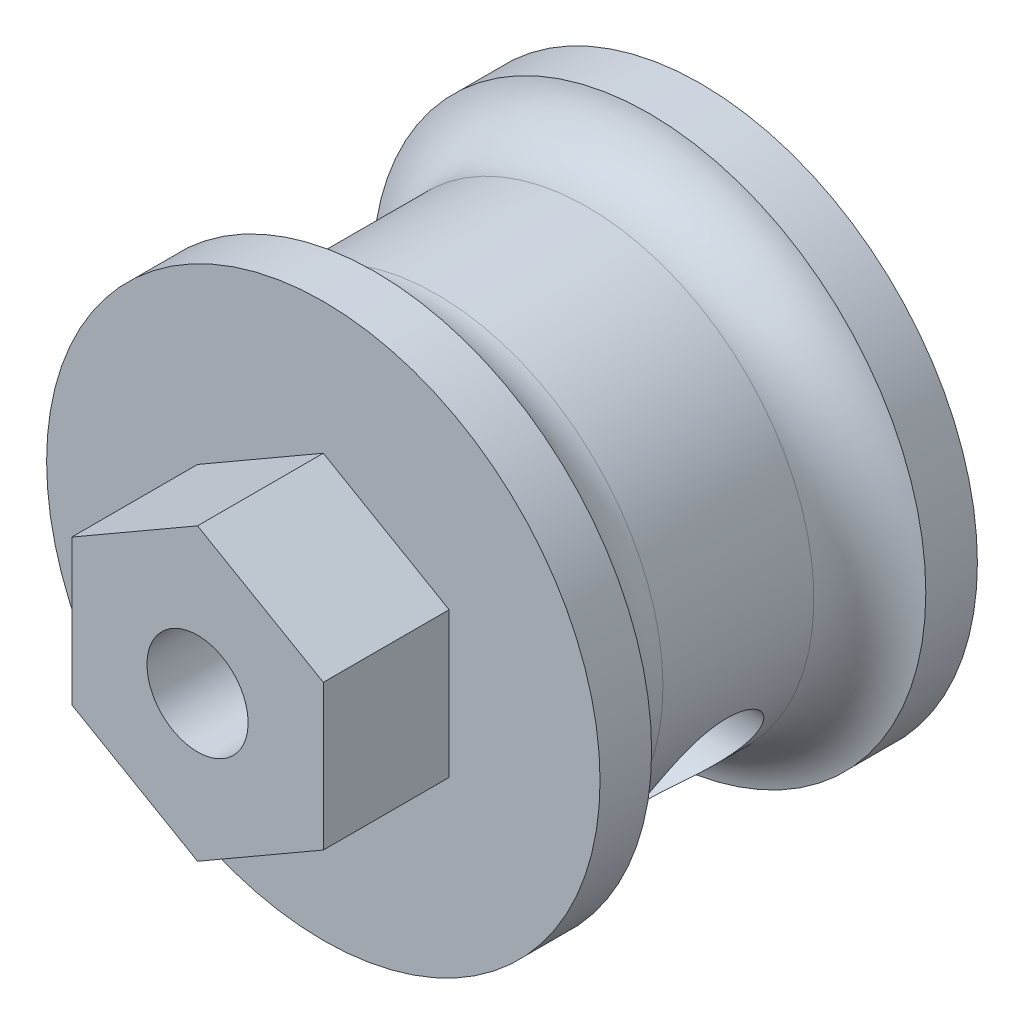
ISO-10303-21;
HEADER;
FILE_DESCRIPTION(('STEP AP214'),'2;1');
FILE_NAME('part.step','',(''),(''),'','','');
FILE_SCHEMA(('AUTOMOTIVE_DESIGN { 1 0 10303 214 1 1 1 1 }'));
ENDSEC;
DATA;
#1=APPLICATION_CONTEXT('core data for automotive mechanical design processes');
#2=APPLICATION_PROTOCOL_DEFINITION('international standard','automotive_design',2000,#1);
#3=PRODUCT_CONTEXT('',#1,'mechanical');
#4=PRODUCT('Part','Part','',(#3));
#5=PRODUCT_RELATED_PRODUCT_CATEGORY('part','',(#4));
#6=PRODUCT_DEFINITION_FORMATION('','',#4);
#7=PRODUCT_DEFINITION_CONTEXT('part definition',#1,'design');
#8=PRODUCT_DEFINITION('design','',#6,#7);
#9=PRODUCT_DEFINITION_SHAPE('','',#8);
#10=(LENGTH_UNIT() NAMED_UNIT(*) SI_UNIT(.MILLI.,.METRE.));
#11=(NAMED_UNIT(*) PLANE_ANGLE_UNIT() SI_UNIT($,.RADIAN.));
#12=(NAMED_UNIT(*) SI_UNIT($,.STERADIAN.) SOLID_ANGLE_UNIT());
#13=UNCERTAINTY_MEASURE_WITH_UNIT(LENGTH_MEASURE(1.E-05),#10,'distance_accuracy_value','');
#14=(GEOMETRIC_REPRESENTATION_CONTEXT(3) GLOBAL_UNCERTAINTY_ASSIGNED_CONTEXT((#13)) GLOBAL_UNIT_ASSIGNED_CONTEXT((#10,
#11,#12)) REPRESENTATION_CONTEXT('',''));
#15=CARTESIAN_POINT('',(0.,0.,0.));
#16=DIRECTION('',(0.,0.,1.));
#17=DIRECTION('',(1.,0.,0.));
#18=AXIS2_PLACEMENT_3D('',#15,#16,#17);
#19=CARTESIAN_POINT('',(0.,-46.36135,19.05));
#20=DIRECTION('',(0.,0.,-1.));
#21=DIRECTION('',(-1.,0.,0.));
#22=AXIS2_PLACEMENT_3D('',#19,#20,#21);
#23=PLANE('',#22);
#24=CARTESIAN_POINT('',(0.,-38.1,19.05));
#25=DIRECTION('',(0.,0.,-1.));
#26=DIRECTION('',(-1.,0.,0.));
#27=AXIS2_PLACEMENT_3D('',#24,#25,#26);
#28=CIRCLE('',#27,13.97);
#29=CARTESIAN_POINT('',(-13.97,-38.1,19.05));
#30=VERTEX_POINT('',#29);
#31=EDGE_CURVE('E134',#30,#30,#28,.T.);
#32=ORIENTED_EDGE('',*,*,#31,.F.);
#33=EDGE_LOOP('',(#32));
#34=FACE_BOUND('',#33,.T.);
#35=DIRECTION('',(-0.866025403784439,-0.5,0.));
#36=VECTOR('',#35,1.);
#37=CARTESIAN_POINT('',(-3.175,-32.6007386859688,19.05));
#38=LINE('',#37,#36);
#39=CARTESIAN_POINT('',(0.,-30.7676515812918,19.05));
#40=VERTEX_POINT('',#39);
#41=CARTESIAN_POINT('',(-6.35,-34.4338257906459,19.05));
#42=VERTEX_POINT('',#41);
#43=EDGE_CURVE('E32',#40,#42,#38,.T.);
#44=ORIENTED_EDGE('',*,*,#43,.F.);
#45=DIRECTION('',(-0.866025403784438,0.5,0.));
#46=VECTOR('',#45,1.);
#47=CARTESIAN_POINT('',(3.175,-32.6007386859688,19.05));
#48=LINE('',#47,#46);
#49=CARTESIAN_POINT('',(6.35,-34.4338257906459,19.05));
#50=VERTEX_POINT('',#49);
#51=EDGE_CURVE('E36',#50,#40,#48,.T.);
#52=ORIENTED_EDGE('',*,*,#51,.F.);
#53=DIRECTION('',(0.,1.,0.));
#54=VECTOR('',#53,1.);
#55=CARTESIAN_POINT('',(6.35,-38.1,19.05));
#56=LINE('',#55,#54);
#57=CARTESIAN_POINT('',(6.35,-41.7661742093541,19.05));
#58=VERTEX_POINT('',#57);
#59=EDGE_CURVE('E271',#58,#50,#56,.T.);
#60=ORIENTED_EDGE('',*,*,#59,.F.);
#61=DIRECTION('',(0.866025403784439,0.5,0.));
#62=VECTOR('',#61,1.);
#63=CARTESIAN_POINT('',(3.175,-43.5992613140312,19.05));
#64=LINE('',#63,#62);
#65=CARTESIAN_POINT('',(0.,-45.4323484187082,19.05));
#66=VERTEX_POINT('',#65);
#67=EDGE_CURVE('E287',#66,#58,#64,.T.);
#68=ORIENTED_EDGE('',*,*,#67,.F.);
#69=DIRECTION('',(0.866025403784438,-0.5,0.));
#70=VECTOR('',#69,1.);
#71=CARTESIAN_POINT('',(-3.175,-43.5992613140312,19.05));
#72=LINE('',#71,#70);
#73=CARTESIAN_POINT('',(-6.35,-41.7661742093541,19.05));
#74=VERTEX_POINT('',#73);
#75=EDGE_CURVE('E284',#74,#66,#72,.T.);
#76=ORIENTED_EDGE('',*,*,#75,.F.);
#77=DIRECTION('',(0.,-1.,0.));
#78=VECTOR('',#77,1.);
#79=CARTESIAN_POINT('',(-6.35,-38.1,19.05));
#80=LINE('',#79,#78);
#81=EDGE_CURVE('E282',#42,#74,#80,.T.);
#82=ORIENTED_EDGE('',*,*,#81,.F.);
#83=EDGE_LOOP('',(#44,#52,#60,#68,#76,#82));
#84=FACE_BOUND('',#83,.T.);
#85=ADVANCED_FACE('F17',(#34,#84),#23,.F.);
#86=CARTESIAN_POINT('',(0.,-38.1,9.525));
#87=DIRECTION('',(0.,0.,-1.));
#88=DIRECTION('',(-1.,0.,0.));
#89=AXIS2_PLACEMENT_3D('',#86,#87,#88);
#90=CYLINDRICAL_SURFACE('',#89,11.43);
#91=CARTESIAN_POINT('',(-9.48678949065488,-44.4754,5.715));
#92=CARTESIAN_POINT('',(-9.55528350161054,-44.3735081379144,5.71499298819661));
#93=CARTESIAN_POINT('',(-9.62213094625265,-44.2704622217479,5.71908817780301));
#94=CARTESIAN_POINT('',(-9.75222618173327,-44.062710723665,5.73598345976555));
#95=CARTESIAN_POINT('',(-9.81547093880646,-43.9580038352138,5.74879077437321));
#96=CARTESIAN_POINT('',(-9.93823601961678,-43.7472411411777,5.78369680806214));
#97=CARTESIAN_POINT('',(-9.99773681655364,-43.6411812581887,5.80584023767689));
#98=CARTESIAN_POINT('',(-10.1123337464472,-43.4291757716585,5.85982944465942));
#99=CARTESIAN_POINT('',(-10.1674310324981,-43.3232301454141,5.89167267148086));
#100=CARTESIAN_POINT('',(-10.2732586056937,-43.1118960168256,5.96556808677806));
#101=CARTESIAN_POINT('',(-10.3239627312728,-43.0065139493173,6.0076764043738));
#102=CARTESIAN_POINT('',(-10.4204486867376,-42.7981200844263,6.10214782593002));
#103=CARTESIAN_POINT('',(-10.4662309912993,-42.6951080592236,6.15450993960476));
#104=CARTESIAN_POINT('',(-10.5526580342309,-42.4929898597353,6.26929408198158));
#105=CARTESIAN_POINT('',(-10.5933159160526,-42.393874161094,6.33168939997622));
#106=CARTESIAN_POINT('',(-10.6696290458326,-42.2005746921232,6.4663825224243));
#107=CARTESIAN_POINT('',(-10.7052850109717,-42.1063902159655,6.5386789043077));
#108=CARTESIAN_POINT('',(-10.7679394727047,-41.9345503512047,6.68398365362768));
#109=CARTESIAN_POINT('',(-10.7954611251133,-41.8562310562385,6.7559839907424));
#110=CARTESIAN_POINT('',(-10.8468049835884,-41.7052849345481,6.90699291037972));
#111=CARTESIAN_POINT('',(-10.870625989883,-41.6326599577205,6.98600375276125));
#112=CARTESIAN_POINT('',(-10.9147421944506,-41.4939072401391,7.15047284033617));
#113=CARTESIAN_POINT('',(-10.9350368835693,-41.4277804382349,7.23593201403398));
#114=CARTESIAN_POINT('',(-10.9723195641483,-41.302712152489,7.41268459716464));
#115=CARTESIAN_POINT('',(-10.9893063458653,-41.2437733003048,7.50398012487309));
#116=CARTESIAN_POINT('',(-11.0193834917986,-41.1366134559686,7.68673207610903));
#117=CARTESIAN_POINT('',(-11.0326316544562,-41.0879921056153,7.77792815927739));
#118=CARTESIAN_POINT('',(-11.0565601653245,-40.9981955188877,7.9642784770862));
#119=CARTESIAN_POINT('',(-11.0672396062507,-40.957022914714,8.05943409637416));
#120=CARTESIAN_POINT('',(-11.0862030376975,-40.8825319491873,8.25294054110255));
#121=CARTESIAN_POINT('',(-11.0944885187034,-40.8492087032029,8.35128933584633));
#122=CARTESIAN_POINT('',(-11.1088322647352,-40.7906576717666,8.55053712712864));
#123=CARTESIAN_POINT('',(-11.1148897032622,-40.7654328909046,8.65143705521408));
#124=CARTESIAN_POINT('',(-11.1298983453744,-40.7023554621676,8.95649905825234));
#125=CARTESIAN_POINT('',(-11.1357342176093,-40.676901456606,9.1635389396154));
#126=CARTESIAN_POINT('',(-11.1396056199392,-40.6601049836764,9.57897505746806));
#127=CARTESIAN_POINT('',(-11.1376404842515,-40.6687654278305,9.78737140821114));
#128=CARTESIAN_POINT('',(-11.1257034494241,-40.7199836391951,10.2005977338773));
#129=CARTESIAN_POINT('',(-11.11569981163,-40.7626757693677,10.4054102770268));
#130=CARTESIAN_POINT('',(-11.0867572151229,-40.8807149047953,10.8047214190575));
#131=CARTESIAN_POINT('',(-11.0678187683124,-40.9560600392402,10.9992206081121));
#132=CARTESIAN_POINT('',(-11.0196549040371,-41.1365715484436,11.3719126779701));
#133=CARTESIAN_POINT('',(-10.9904533871585,-41.2416685275767,11.5501422428716));
#134=CARTESIAN_POINT('',(-10.920156601719,-41.4778997039078,11.8857613867387));
#135=CARTESIAN_POINT('',(-10.8790623016428,-41.6090317806739,12.0431526611427));
#136=CARTESIAN_POINT('',(-10.7837400451109,-41.8918308493033,12.3325006423125));
#137=CARTESIAN_POINT('',(-10.7295566409318,-42.0434274284976,12.4645409582674));
#138=CARTESIAN_POINT('',(-10.607189098811,-42.3616247542437,12.7010601391913));
#139=CARTESIAN_POINT('',(-10.539006694769,-42.5282236411938,12.8055424138092));
#140=CARTESIAN_POINT('',(-10.3868911002746,-42.8742988162341,12.987909817481));
#141=CARTESIAN_POINT('',(-10.3026270643302,-43.0539850551563,13.0651163378358));
#142=CARTESIAN_POINT('',(-10.1202407577416,-43.4166561084806,13.1899660473463));
#143=CARTESIAN_POINT('',(-10.0221092087801,-43.5996430591907,13.2375893272302));
#144=CARTESIAN_POINT('',(-9.85067390652596,-43.898921046763,13.2930309006267));
#145=CARTESIAN_POINT('',(-9.78091297177308,-44.0158427813386,13.3089768552178));
#146=CARTESIAN_POINT('',(-9.63703913460951,-44.2474376839007,13.3299438259072));
#147=CARTESIAN_POINT('',(-9.56294169909329,-44.3621171042608,13.3350014970089));
#148=CARTESIAN_POINT('',(-9.48678949065489,-44.4754,13.335));
#149=B_SPLINE_CURVE_WITH_KNOTS('',3,(#91,#92,#93,#94,#95,#96,#97,#98,#99,#100,#101,#102,#103,
#104,#105,#106,#107,#108,#109,#110,#111,#112,#113,#114,#115,#116,#117,#118,#119,#120,#121,#122,
#123,#124,#125,#126,#127,#128,#129,#130,#131,#132,#133,#134,#135,#136,#137,#138,#139,#140,#141,
#142,#143,#144,#145,#146,#147,#148),.UNSPECIFIED.,.F.,.F.,(4,2,2,2,2,2,2,2,2,2,2,2,2,2,2,2,2,2,
2,2,2,2,2,2,2,2,2,2,4),(0.,0.368295002018657,0.736895689033342,1.10728201791471,
1.47757103824544,1.84993208123406,2.22225718025307,2.59360699303281,2.9649035066941,
3.29414729628739,3.62349760696048,3.95289543208676,4.28241349682817,4.5946230744199,
4.90694276448426,5.21906758245317,5.53130806755451,6.15414642557903,6.77703794133937,
7.40240099383736,8.02772822173075,8.65160873606145,9.27543845918768,9.89717401003109,
10.5188325998403,11.1550187523914,11.7916325903299,12.2023954081563,12.6117732316374),.UNSPECIFIED.);
#150=CARTESIAN_POINT('',(-9.48678949065488,-44.4754,5.715));
#151=VERTEX_POINT('',#150);
#152=CARTESIAN_POINT('',(-9.48678949065488,-44.4754,13.335));
#153=VERTEX_POINT('',#152);
#154=EDGE_CURVE('E204',#151,#153,#149,.T.);
#155=ORIENTED_EDGE('',*,*,#154,.T.);
#156=CARTESIAN_POINT('',(0.,-38.1,13.335));
#157=DIRECTION('',(0.,0.,1.));
#158=DIRECTION('',(1.,0.,0.));
#159=AXIS2_PLACEMENT_3D('',#156,#157,#158);
#160=CIRCLE('',#159,11.43);
#161=CARTESIAN_POINT('',(-5.08,-48.3390673403392,13.335));
#162=VERTEX_POINT('',#161);
#163=EDGE_CURVE('E203',#153,#162,#160,.F.);
#164=ORIENTED_EDGE('',*,*,#163,.T.);
#165=DIRECTION('',(0.,0.,-1.));
#166=VECTOR('',#165,1.);
#167=CARTESIAN_POINT('',(-5.08,-48.3390673403392,9.525));
#168=LINE('',#167,#166);
#169=CARTESIAN_POINT('',(-5.08,-48.3390673403392,5.715));
#170=VERTEX_POINT('',#169);
#171=EDGE_CURVE('E130',#162,#170,#168,.T.);
#172=ORIENTED_EDGE('',*,*,#171,.T.);
#173=CARTESIAN_POINT('',(0.,-38.1,5.715));
#174=DIRECTION('',(0.,0.,-1.));
#175=DIRECTION('',(-1.,0.,0.));
#176=AXIS2_PLACEMENT_3D('',#173,#174,#175);
#177=CIRCLE('',#176,11.43);
#178=EDGE_CURVE('E199',#170,#151,#177,.F.);
#179=ORIENTED_EDGE('',*,*,#178,.T.);
#180=EDGE_LOOP('',(#155,#164,#172,#179));
#181=FACE_BOUND('',#180,.T.);
#182=CARTESIAN_POINT('',(9.48678949065488,-44.4754,6.731));
#183=CARTESIAN_POINT('',(9.42068728047673,-44.5737611387116,6.73099997835017));
#184=CARTESIAN_POINT('',(9.35303741450383,-44.6711128783271,6.73619538392011));
#185=CARTESIAN_POINT('',(9.21521346613033,-44.8630409854268,6.75633736179169));
#186=CARTESIAN_POINT('',(9.14503758391582,-44.957615283205,6.77129102230727));
#187=CARTESIAN_POINT('',(9.00252438545298,-45.1436650400816,6.81042413590952));
#188=CARTESIAN_POINT('',(8.93018076751102,-45.2351293892079,6.834633512694));
#189=CARTESIAN_POINT('',(8.78418423052112,-45.4141222419487,6.89173933505054));
#190=CARTESIAN_POINT('',(8.71053157977484,-45.5016515394086,6.92463401918842));
#191=CARTESIAN_POINT('',(8.48972068304826,-45.7563361045266,7.0350811693391));
#192=CARTESIAN_POINT('',(8.34130640311109,-45.9174053213202,7.1247940523502));
#193=CARTESIAN_POINT('',(8.12065594718471,-46.1443197345132,7.28232038593415));
#194=CARTESIAN_POINT('',(8.04744138899779,-46.2175031650131,7.33864866735168));
#195=CARTESIAN_POINT('',(7.90244064004287,-46.3587254385751,7.45905648794177));
#196=CARTESIAN_POINT('',(7.83065403554464,-46.426765788257,7.52313374270946));
#197=CARTESIAN_POINT('',(7.65642146449339,-46.5878734608606,7.69112200952139));
#198=CARTESIAN_POINT('',(7.55536861432803,-46.6777311425436,7.79963044187247));
#199=CARTESIAN_POINT('',(7.36323006381145,-46.8432103370553,8.0348523430969));
#200=CARTESIAN_POINT('',(7.27212807589897,-46.9188552640559,8.16153525298436));
#201=CARTESIAN_POINT('',(7.13251056837468,-47.0318344561213,8.3926658192894));
#202=CARTESIAN_POINT('',(7.07948680923593,-47.0738130583412,8.49208571873815));
#203=CARTESIAN_POINT('',(6.98553301746977,-47.1471418907582,8.70017076489355));
#204=CARTESIAN_POINT('',(6.94458253710025,-47.1785101045241,8.80881987385447));
#205=CARTESIAN_POINT('',(6.88494676114968,-47.2237910374511,9.0134518447762));
#206=CARTESIAN_POINT('',(6.86357215846582,-47.2398362745573,9.10816466061194));
#207=CARTESIAN_POINT('',(6.83387164167014,-47.2620661761461,9.30073813300019));
#208=CARTESIAN_POINT('',(6.82553343381557,-47.2682601308025,9.39859573491161));
#209=CARTESIAN_POINT('',(6.82285572921696,-47.270253256694,9.59480810540598));
#210=CARTESIAN_POINT('',(6.8285435639455,-47.2660321328559,9.69316347137918));
#211=CARTESIAN_POINT('',(6.85329254337115,-47.2475409949907,9.8872129705383));
#212=CARTESIAN_POINT('',(6.87236512459736,-47.2332623873588,9.98290475509221));
#213=CARTESIAN_POINT('',(6.92802493699494,-47.1911411304439,10.1922405923491));
#214=CARTESIAN_POINT('',(6.96775871126224,-47.1608321348129,10.3045380397089));
#215=CARTESIAN_POINT('',(7.06038960468063,-47.088839740722,10.5196381348261));
#216=CARTESIAN_POINT('',(7.11331416049084,-47.0471326166266,10.622420372151));
#217=CARTESIAN_POINT('',(7.25661086034067,-46.9316780446926,10.8663738975714));
#218=CARTESIAN_POINT('',(7.35258998508993,-46.8522663066101,11.0015265649022));
#219=CARTESIAN_POINT('',(7.5558139132904,-46.6774507611769,11.2514818161764));
#220=CARTESIAN_POINT('',(7.66308338188551,-46.5820116575957,11.3662383087135));
#221=CARTESIAN_POINT('',(7.84873064589295,-46.4098135801775,11.5435550891194));
#222=CARTESIAN_POINT('',(7.9256182074992,-46.33658381434,11.6111977395122));
#223=CARTESIAN_POINT('',(8.08090939185512,-46.1842824067236,11.7376824849069));
#224=CARTESIAN_POINT('',(8.15931351589115,-46.1052088080864,11.7965216118417));
#225=CARTESIAN_POINT('',(8.31663200440622,-45.9416463757245,11.905379751891));
#226=CARTESIAN_POINT('',(8.39554649556655,-45.8571561471791,11.9553964806357));
#227=CARTESIAN_POINT('',(8.55308337440856,-45.6831028315147,12.0464159349984));
#228=CARTESIAN_POINT('',(8.63170560011267,-45.5935372803386,12.0874142342115));
#229=CARTESIAN_POINT('',(8.7884215851226,-45.4091236131963,12.1602401716093));
#230=CARTESIAN_POINT('',(8.86650787600748,-45.3142431148018,12.19200210582));
#231=CARTESIAN_POINT('',(9.02087217488916,-45.1202654792798,12.245423328392));
#232=CARTESIAN_POINT('',(9.09715040160854,-45.0211688562749,12.2670838447091));
#233=CARTESIAN_POINT('',(9.24709263559753,-44.8195183504524,12.2996040022807));
#234=CARTESIAN_POINT('',(9.32076070355206,-44.7169703697275,12.310481201259));
#235=CARTESIAN_POINT('',(9.46487704559083,-44.5091347405894,12.3207329225754));
#236=CARTESIAN_POINT('',(9.53532651376782,-44.4038481313288,12.3201117460985));
#237=CARTESIAN_POINT('',(9.70471712623466,-44.1413453676988,12.3033736378088));
#238=CARTESIAN_POINT('',(9.80142348036796,-43.9830594679815,12.2800858672301));
#239=CARTESIAN_POINT('',(9.98423231969735,-43.667155579896,12.2044539353537));
#240=CARTESIAN_POINT('',(10.0703402479469,-43.5095372891645,12.152124765618));
#241=CARTESIAN_POINT('',(10.1903606424656,-43.2777588304976,12.0507289286072));
#242=CARTESIAN_POINT('',(10.2289790334192,-43.2009780723255,12.0129165499454));
#243=CARTESIAN_POINT('',(10.3028688672286,-43.0500329121976,11.9296168718205));
#244=CARTESIAN_POINT('',(10.3381419083033,-42.9758672716343,11.8841332663863));
#245=CARTESIAN_POINT('',(10.4052006685171,-42.8310749442386,11.7855964047065));
#246=CARTESIAN_POINT('',(10.4369868327246,-42.7604478063749,11.7325441165281));
#247=CARTESIAN_POINT('',(10.4969821144457,-42.623698540341,11.6191678350094));
#248=CARTESIAN_POINT('',(10.5251917205267,-42.5575757974305,11.5588448370681));
#249=CARTESIAN_POINT('',(10.5981570741826,-42.3823582201649,11.3825989637257));
#250=CARTESIAN_POINT('',(10.6391454789831,-42.2789031681307,11.2593293494719));
#251=CARTESIAN_POINT('',(10.7100417069427,-42.0937222675332,10.9947401942827));
#252=CARTESIAN_POINT('',(10.7399543339013,-42.0119870029911,10.8534285144219));
#253=CARTESIAN_POINT('',(10.7874571861122,-41.8789284072252,10.5679530847001));
#254=CARTESIAN_POINT('',(10.8057827298049,-41.8258317552287,10.4247364630884));
#255=CARTESIAN_POINT('',(10.8337899544648,-41.7435979429715,10.1307859304557));
#256=CARTESIAN_POINT('',(10.8434731538405,-41.7144565739808,9.98005334486081));
#257=CARTESIAN_POINT('',(10.8543587405995,-41.6816320343877,9.67899254682022));
#258=CARTESIAN_POINT('',(10.8557470762306,-41.6773907108003,9.52873156980151));
#259=CARTESIAN_POINT('',(10.8505821178069,-41.6930258011586,9.22961087966055));
#260=CARTESIAN_POINT('',(10.8440292117461,-41.7129010368149,9.08075109843662));
#261=CARTESIAN_POINT('',(10.8228299079689,-41.7759134077951,8.78922428552127));
#262=CARTESIAN_POINT('',(10.8082135809293,-41.818964101231,8.6465363566341));
#263=CARTESIAN_POINT('',(10.7705527781845,-41.926659959187,8.37075917934343));
#264=CARTESIAN_POINT('',(10.7475085390361,-41.9913045176008,8.23766966165492));
#265=CARTESIAN_POINT('',(10.6924221919768,-42.1402130006748,7.98385703915091));
#266=CARTESIAN_POINT('',(10.6603241355032,-42.2245983430144,7.86321740997221));
#267=CARTESIAN_POINT('',(10.5869187414888,-42.4095151365627,7.63826719834107));
#268=CARTESIAN_POINT('',(10.5456116220607,-42.510046205351,7.53395622925088));
#269=CARTESIAN_POINT('',(10.4525456164099,-42.7263801143558,7.34121600183861));
#270=CARTESIAN_POINT('',(10.4005363090334,-42.8425200112907,7.25328724735429));
#271=CARTESIAN_POINT('',(10.2871560171401,-43.0836810057648,7.09803793774488));
#272=CARTESIAN_POINT('',(10.2257800149042,-43.2087068441893,7.03072848680649));
#273=CARTESIAN_POINT('',(10.0897729925309,-43.4726102448365,6.91287444993781));
#274=CARTESIAN_POINT('',(10.0145100256203,-43.6118408200645,6.8638608513438));
#275=CARTESIAN_POINT('',(9.85546258221713,-43.8914236908755,6.78888197351615));
#276=CARTESIAN_POINT('',(9.77168552221405,-44.0317749137157,6.76289682317037));
#277=CARTESIAN_POINT('',(9.6523983822745,-44.2220730756956,6.74203138335628));
#278=CARTESIAN_POINT('',(9.61987664908113,-44.273049810963,6.7378728424776));
#279=CARTESIAN_POINT('',(9.55396768928843,-44.3745721825639,6.73235770889757));
#280=CARTESIAN_POINT('',(9.52058080931735,-44.4251179810894,6.73100001106735));
#281=CARTESIAN_POINT('',(9.48678949065488,-44.4754,6.731));
#282=B_SPLINE_CURVE_WITH_KNOTS('',3,(#182,#183,#184,#185,#186,#187,#188,#189,#190,#191,#192,
#193,#194,#195,#196,#197,#198,#199,#200,#201,#202,#203,#204,#205,#206,#207,#208,#209,#210,#211,
#212,#213,#214,#215,#216,#217,#218,#219,#220,#221,#222,#223,#224,#225,#226,#227,#228,#229,#230,
#231,#232,#233,#234,#235,#236,#237,#238,#239,#240,#241,#242,#243,#244,#245,#246,#247,#248,#249,
#250,#251,#252,#253,#254,#255,#256,#257,#258,#259,#260,#261,#262,#263,#264,#265,#266,#267,#268,
#269,#270,#271,#272,#273,#274,#275,#276,#277,#278,#279,#280,#281),.UNSPECIFIED.,.T.,.F.,(4,2,2,
2,2,2,2,2,2,2,2,2,2,2,2,2,2,2,2,2,2,2,2,2,2,2,2,2,2,2,2,2,2,2,2,2,2,2,2,2,2,2,2,2,2,2,2,2,2,4),
(0.,0.355458299712571,0.711175085524168,1.06805176273938,1.42485611867143,2.13154737728958,
2.48482356288731,2.8379958550478,3.35663345849568,3.87440901673198,4.2340296802024,
4.59303773140336,4.88702248592823,5.18072983572113,5.47500996256914,5.76954184221741,
6.13624432847796,6.50371601135665,7.05213682350521,7.60178162488474,7.97903990723943,
8.35642509525321,8.73390785604313,9.11157548068871,9.49186741297466,9.87211310388501,
10.2517386453613,10.6312221835859,11.1897005549855,11.7478909001118,12.0292340168347,
12.3104420394275,12.5916141264897,12.8727477632231,13.368060192397,13.863157541737,
14.3224116168672,14.7815849878888,15.2304251260773,15.6792433356732,16.1263989859001,
16.5735420862172,17.0235112580082,17.4734697736038,17.9354862067529,18.3977510156094,
18.8928607691903,19.3875428783281,19.569324194928,19.75103377233),.UNSPECIFIED.);
#283=CARTESIAN_POINT('',(9.48678949065488,-44.4754,6.731));
#284=VERTEX_POINT('',#283);
#285=EDGE_CURVE('E133',#284,#284,#282,.T.);
#286=ORIENTED_EDGE('',*,*,#285,.T.);
#287=EDGE_LOOP('',(#286));
#288=FACE_BOUND('',#287,.T.);
#289=ADVANCED_FACE('F152',(#181,#288),#90,.T.);
#290=CARTESIAN_POINT('',(0.,-38.1,9.525));
#291=DIRECTION('',(0.,0.,-1.));
#292=DIRECTION('',(-1.,0.,0.));
#293=AXIS2_PLACEMENT_3D('',#290,#291,#292);
#294=CYLINDRICAL_SURFACE('',#293,13.97);
#295=CARTESIAN_POINT('',(0.,-38.1,2.60414802666537));
#296=DIRECTION('',(0.,0.,-1.));
#297=DIRECTION('',(-1.,0.,0.));
#298=AXIS2_PLACEMENT_3D('',#295,#296,#297);
#299=CIRCLE('',#298,13.97);
#300=CARTESIAN_POINT('',(-13.97,-38.1,2.60414802666537));
#301=VERTEX_POINT('',#300);
#302=EDGE_CURVE('E11',#301,#301,#299,.T.);
#303=ORIENTED_EDGE('',*,*,#302,.T.);
#304=EDGE_LOOP('',(#303));
#305=FACE_BOUND('',#304,.T.);
#306=CARTESIAN_POINT('',(0.,-38.1,0.));
#307=DIRECTION('',(0.,0.,-1.));
#308=DIRECTION('',(-1.,0.,0.));
#309=AXIS2_PLACEMENT_3D('',#306,#307,#308);
#310=CIRCLE('',#309,13.97);
#311=CARTESIAN_POINT('',(-13.97,-38.1,0.));
#312=VERTEX_POINT('',#311);
#313=EDGE_CURVE('E140',#312,#312,#310,.T.);
#314=ORIENTED_EDGE('',*,*,#313,.F.);
#315=EDGE_LOOP('',(#314));
#316=FACE_BOUND('',#315,.T.);
#317=ADVANCED_FACE('F177',(#305,#316),#294,.T.);
#318=CARTESIAN_POINT('',(0.,-46.36135,0.));
#319=DIRECTION('',(0.,0.,1.));
#320=DIRECTION('',(1.,0.,0.));
#321=AXIS2_PLACEMENT_3D('',#318,#319,#320);
#322=PLANE('',#321);
#323=CARTESIAN_POINT('',(0.,-38.1,0.));
#324=DIRECTION('',(0.,0.,-1.));
#325=DIRECTION('',(-1.,0.,0.));
#326=AXIS2_PLACEMENT_3D('',#323,#324,#325);
#327=CIRCLE('',#326,2.5527);
#328=CARTESIAN_POINT('',(-2.5527,-38.1,0.));
#329=VERTEX_POINT('',#328);
#330=EDGE_CURVE('E137',#329,#329,#327,.T.);
#331=ORIENTED_EDGE('',*,*,#330,.F.);
#332=EDGE_LOOP('',(#331));
#333=FACE_BOUND('',#332,.T.);
#334=ORIENTED_EDGE('',*,*,#313,.T.);
#335=EDGE_LOOP('',(#334));
#336=FACE_BOUND('',#335,.T.);
#337=ADVANCED_FACE('F174',(#333,#336),#322,.F.);
#338=CARTESIAN_POINT('',(0.,-38.1,9.525));
#339=DIRECTION('',(0.,0.,-1.));
#340=DIRECTION('',(-1.,0.,0.));
#341=AXIS2_PLACEMENT_3D('',#338,#339,#340);
#342=CYLINDRICAL_SURFACE('',#341,2.5527);
#343=ORIENTED_EDGE('',*,*,#330,.T.);
#344=EDGE_LOOP('',(#343));
#345=FACE_BOUND('',#344,.T.);
#346=CARTESIAN_POINT('',(0.,-38.1,25.4));
#347=DIRECTION('',(0.,0.,-1.));
#348=DIRECTION('',(-1.,0.,0.));
#349=AXIS2_PLACEMENT_3D('',#346,#347,#348);
#350=CIRCLE('',#349,2.5527);
#351=CARTESIAN_POINT('',(-2.5527,-38.1,25.4));
#352=VERTEX_POINT('',#351);
#353=EDGE_CURVE('E106',#352,#352,#350,.T.);
#354=ORIENTED_EDGE('',*,*,#353,.F.);
#355=EDGE_LOOP('',(#354));
#356=FACE_BOUND('',#355,.T.);
#357=ADVANCED_FACE('F167',(#345,#356),#342,.F.);
#358=CARTESIAN_POINT('',(0.,-38.1,9.525));
#359=DIRECTION('',(0.,0.,-1.));
#360=DIRECTION('',(-1.,0.,0.));
#361=AXIS2_PLACEMENT_3D('',#358,#359,#360);
#362=CYLINDRICAL_SURFACE('',#361,13.97);
#363=CARTESIAN_POINT('',(0.,-38.1,16.4458519733347));
#364=DIRECTION('',(0.,0.,1.));
#365=DIRECTION('',(1.,0.,0.));
#366=AXIS2_PLACEMENT_3D('',#363,#364,#365);
#367=CIRCLE('',#366,13.97);
#368=CARTESIAN_POINT('',(13.97,-38.1,16.4458519733347));
#369=VERTEX_POINT('',#368);
#370=EDGE_CURVE('E25',#369,#369,#367,.T.);
#371=ORIENTED_EDGE('',*,*,#370,.T.);
#372=EDGE_LOOP('',(#371));
#373=FACE_BOUND('',#372,.T.);
#374=ORIENTED_EDGE('',*,*,#31,.T.);
#375=EDGE_LOOP('',(#374));
#376=FACE_BOUND('',#375,.T.);
#377=ADVANCED_FACE('F161',(#373,#376),#362,.T.);
#378=CARTESIAN_POINT('',(-12.7,-44.4754,9.525));
#379=DIRECTION('',(1.,0.,0.));
#380=DIRECTION('',(0.,0.,-1.));
#381=AXIS2_PLACEMENT_3D('',#378,#379,#380);
#382=CYLINDRICAL_SURFACE('',#381,2.794);
#383=CARTESIAN_POINT('',(-5.08,-44.4754,9.525));
#384=DIRECTION('',(1.,0.,0.));
#385=DIRECTION('',(0.,0.,-1.));
#386=AXIS2_PLACEMENT_3D('',#383,#384,#385);
#387=CIRCLE('',#386,2.794);
#388=CARTESIAN_POINT('',(-5.08,-44.4754,6.731));
#389=VERTEX_POINT('',#388);
#390=EDGE_CURVE('E109',#389,#389,#387,.T.);
#391=ORIENTED_EDGE('',*,*,#390,.F.);
#392=EDGE_LOOP('',(#391));
#393=FACE_BOUND('',#392,.T.);
#394=ORIENTED_EDGE('',*,*,#285,.F.);
#395=EDGE_LOOP('',(#394));
#396=FACE_BOUND('',#395,.T.);
#397=ADVANCED_FACE('F155',(#393,#396),#382,.F.);
#398=CARTESIAN_POINT('',(-30.48,-44.4754,9.525));
#399=DIRECTION('',(1.,0.,0.));
#400=DIRECTION('',(0.,0.,-1.));
#401=AXIS2_PLACEMENT_3D('',#398,#399,#400);
#402=CYLINDRICAL_SURFACE('',#401,3.81);
#403=DIRECTION('',(1.,0.,0.));
#404=VECTOR('',#403,1.);
#405=CARTESIAN_POINT('',(-30.48,-44.4754,5.715));
#406=LINE('',#405,#404);
#407=CARTESIAN_POINT('',(-5.08,-44.4754,5.715));
#408=VERTEX_POINT('',#407);
#409=EDGE_CURVE('E126',#151,#408,#406,.T.);
#410=ORIENTED_EDGE('',*,*,#409,.T.);
#411=CARTESIAN_POINT('',(-5.08,-44.4754,9.525));
#412=DIRECTION('',(1.,0.,0.));
#413=DIRECTION('',(0.,0.,-1.));
#414=AXIS2_PLACEMENT_3D('',#411,#412,#413);
#415=CIRCLE('',#414,3.81);
#416=CARTESIAN_POINT('',(-5.08,-44.4754,13.335));
#417=VERTEX_POINT('',#416);
#418=EDGE_CURVE('E112',#408,#417,#415,.T.);
#419=ORIENTED_EDGE('',*,*,#418,.T.);
#420=DIRECTION('',(1.,0.,0.));
#421=VECTOR('',#420,1.);
#422=CARTESIAN_POINT('',(-30.48,-44.4754,13.335));
#423=LINE('',#422,#421);
#424=EDGE_CURVE('E128',#153,#417,#423,.T.);
#425=ORIENTED_EDGE('',*,*,#424,.F.);
#426=ORIENTED_EDGE('',*,*,#154,.F.);
#427=EDGE_LOOP('',(#410,#419,#425,#426));
#428=FACE_BOUND('',#427,.T.);
#429=ADVANCED_FACE('F160',(#428),#402,.F.);
#430=CARTESIAN_POINT('',(-30.48,-47.0027,13.335));
#431=DIRECTION('',(0.,0.,1.));
#432=DIRECTION('',(0.,-1.,0.));
#433=AXIS2_PLACEMENT_3D('',#430,#431,#432);
#434=PLANE('',#433);
#435=ORIENTED_EDGE('',*,*,#424,.T.);
#436=DIRECTION('',(0.,-1.,0.));
#437=VECTOR('',#436,1.);
#438=CARTESIAN_POINT('',(-5.08,-47.0027,13.335));
#439=LINE('',#438,#437);
#440=EDGE_CURVE('E120',#417,#162,#439,.T.);
#441=ORIENTED_EDGE('',*,*,#440,.T.);
#442=CARTESIAN_POINT('',(0.,-38.1,13.335));
#443=DIRECTION('',(0.,0.,1.));
#444=DIRECTION('',(0.,-1.,0.));
#445=AXIS2_PLACEMENT_3D('',#442,#443,#444);
#446=CIRCLE('',#445,11.43);
#447=EDGE_CURVE('E215',#153,#162,#446,.T.);
#448=ORIENTED_EDGE('',*,*,#447,.F.);
#449=EDGE_LOOP('',(#435,#441,#448));
#450=FACE_BOUND('',#449,.T.);
#451=ADVANCED_FACE('F229',(#450),#434,.F.);
#452=CARTESIAN_POINT('',(-30.48,-47.0027,5.715));
#453=DIRECTION('',(0.,0.,1.));
#454=DIRECTION('',(1.,0.,0.));
#455=AXIS2_PLACEMENT_3D('',#452,#453,#454);
#456=PLANE('',#455);
#457=CARTESIAN_POINT('',(0.,-38.1,5.715));
#458=DIRECTION('',(0.,0.,1.));
#459=DIRECTION('',(1.,0.,0.));
#460=AXIS2_PLACEMENT_3D('',#457,#458,#459);
#461=CIRCLE('',#460,11.43);
#462=EDGE_CURVE('E143',#151,#170,#461,.T.);
#463=ORIENTED_EDGE('',*,*,#462,.T.);
#464=DIRECTION('',(0.,-1.,0.));
#465=VECTOR('',#464,1.);
#466=CARTESIAN_POINT('',(-5.08,-47.0027,5.715));
#467=LINE('',#466,#465);
#468=EDGE_CURVE('E123',#408,#170,#467,.T.);
#469=ORIENTED_EDGE('',*,*,#468,.F.);
#470=ORIENTED_EDGE('',*,*,#409,.F.);
#471=EDGE_LOOP('',(#463,#469,#470));
#472=FACE_BOUND('',#471,.T.);
#473=ADVANCED_FACE('F214',(#472),#456,.T.);
#474=CARTESIAN_POINT('',(-5.08,-45.085,9.525));
#475=DIRECTION('',(1.,0.,0.));
#476=DIRECTION('',(0.,1.,0.));
#477=AXIS2_PLACEMENT_3D('',#474,#475,#476);
#478=PLANE('',#477);
#479=ORIENTED_EDGE('',*,*,#390,.T.);
#480=EDGE_LOOP('',(#479));
#481=FACE_BOUND('',#480,.T.);
#482=ORIENTED_EDGE('',*,*,#440,.F.);
#483=ORIENTED_EDGE('',*,*,#418,.F.);
#484=ORIENTED_EDGE('',*,*,#468,.T.);
#485=ORIENTED_EDGE('',*,*,#171,.F.);
#486=EDGE_LOOP('',(#482,#483,#484,#485));
#487=FACE_BOUND('',#486,.T.);
#488=ADVANCED_FACE('F211',(#481,#487),#478,.F.);
#489=CARTESIAN_POINT('',(-3.175,-32.6007386859688,25.4));
#490=DIRECTION('',(0.5,-0.866025403784439,0.));
#491=DIRECTION('',(0.866025403784439,0.5,0.));
#492=AXIS2_PLACEMENT_3D('',#489,#490,#491);
#493=PLANE('',#492);
#494=ORIENTED_EDGE('',*,*,#43,.T.);
#495=DIRECTION('',(0.,0.,-1.));
#496=VECTOR('',#495,1.);
#497=CARTESIAN_POINT('',(-6.35,-34.4338257906459,25.4));
#498=LINE('',#497,#496);
#499=CARTESIAN_POINT('',(-6.35,-34.4338257906459,25.4));
#500=VERTEX_POINT('',#499);
#501=EDGE_CURVE('E91',#500,#42,#498,.T.);
#502=ORIENTED_EDGE('',*,*,#501,.F.);
#503=DIRECTION('',(-0.866025403784439,-0.5,0.));
#504=VECTOR('',#503,1.);
#505=CARTESIAN_POINT('',(-3.175,-32.6007386859688,25.4));
#506=LINE('',#505,#504);
#507=CARTESIAN_POINT('',(0.,-30.7676515812918,25.4));
#508=VERTEX_POINT('',#507);
#509=EDGE_CURVE('E97',#508,#500,#506,.T.);
#510=ORIENTED_EDGE('',*,*,#509,.F.);
#511=DIRECTION('',(0.,0.,-1.));
#512=VECTOR('',#511,1.);
#513=CARTESIAN_POINT('',(0.,-30.7676515812918,25.4));
#514=LINE('',#513,#512);
#515=EDGE_CURVE('E280',#508,#40,#514,.T.);
#516=ORIENTED_EDGE('',*,*,#515,.T.);
#517=EDGE_LOOP('',(#494,#502,#510,#516));
#518=FACE_BOUND('',#517,.T.);
#519=ADVANCED_FACE('F108',(#518),#493,.F.);
#520=CARTESIAN_POINT('',(-6.35,-38.1,25.4));
#521=DIRECTION('',(1.,0.,0.));
#522=DIRECTION('',(0.,1.,0.));
#523=AXIS2_PLACEMENT_3D('',#520,#521,#522);
#524=PLANE('',#523);
#525=ORIENTED_EDGE('',*,*,#81,.T.);
#526=DIRECTION('',(0.,0.,-1.));
#527=VECTOR('',#526,1.);
#528=CARTESIAN_POINT('',(-6.35,-41.7661742093541,25.4));
#529=LINE('',#528,#527);
#530=CARTESIAN_POINT('',(-6.35,-41.7661742093541,25.4));
#531=VERTEX_POINT('',#530);
#532=EDGE_CURVE('E93',#531,#74,#529,.T.);
#533=ORIENTED_EDGE('',*,*,#532,.F.);
#534=DIRECTION('',(0.,-1.,0.));
#535=VECTOR('',#534,1.);
#536=CARTESIAN_POINT('',(-6.35,-38.1,25.4));
#537=LINE('',#536,#535);
#538=EDGE_CURVE('E86',#500,#531,#537,.T.);
#539=ORIENTED_EDGE('',*,*,#538,.F.);
#540=ORIENTED_EDGE('',*,*,#501,.T.);
#541=EDGE_LOOP('',(#525,#533,#539,#540));
#542=FACE_BOUND('',#541,.T.);
#543=ADVANCED_FACE('F89',(#542),#524,.F.);
#544=CARTESIAN_POINT('',(-3.175,-43.5992613140312,25.4));
#545=DIRECTION('',(0.5,0.866025403784438,0.));
#546=DIRECTION('',(-0.866025403784438,0.5,0.));
#547=AXIS2_PLACEMENT_3D('',#544,#545,#546);
#548=PLANE('',#547);
#549=ORIENTED_EDGE('',*,*,#75,.T.);
#550=DIRECTION('',(0.,0.,-1.));
#551=VECTOR('',#550,1.);
#552=CARTESIAN_POINT('',(0.,-45.4323484187082,25.4));
#553=LINE('',#552,#551);
#554=CARTESIAN_POINT('',(0.,-45.4323484187082,25.4));
#555=VERTEX_POINT('',#554);
#556=EDGE_CURVE('E114',#555,#66,#553,.T.);
#557=ORIENTED_EDGE('',*,*,#556,.F.);
#558=DIRECTION('',(0.866025403784438,-0.5,0.));
#559=VECTOR('',#558,1.);
#560=CARTESIAN_POINT('',(-3.175,-43.5992613140312,25.4));
#561=LINE('',#560,#559);
#562=EDGE_CURVE('E96',#531,#555,#561,.T.);
#563=ORIENTED_EDGE('',*,*,#562,.F.);
#564=ORIENTED_EDGE('',*,*,#532,.T.);
#565=EDGE_LOOP('',(#549,#557,#563,#564));
#566=FACE_BOUND('',#565,.T.);
#567=ADVANCED_FACE('F247',(#566),#548,.F.);
#568=CARTESIAN_POINT('',(3.175,-43.5992613140312,25.4));
#569=DIRECTION('',(-0.5,0.866025403784439,0.));
#570=DIRECTION('',(-0.866025403784439,-0.5,0.));
#571=AXIS2_PLACEMENT_3D('',#568,#569,#570);
#572=PLANE('',#571);
#573=ORIENTED_EDGE('',*,*,#67,.T.);
#574=DIRECTION('',(0.,0.,-1.));
#575=VECTOR('',#574,1.);
#576=CARTESIAN_POINT('',(6.35,-41.7661742093541,25.4));
#577=LINE('',#576,#575);
#578=CARTESIAN_POINT('',(6.35,-41.7661742093541,25.4));
#579=VERTEX_POINT('',#578);
#580=EDGE_CURVE('E295',#579,#58,#577,.T.);
#581=ORIENTED_EDGE('',*,*,#580,.F.);
#582=DIRECTION('',(0.866025403784439,0.5,0.));
#583=VECTOR('',#582,1.);
#584=CARTESIAN_POINT('',(3.175,-43.5992613140312,25.4));
#585=LINE('',#584,#583);
#586=EDGE_CURVE('E275',#555,#579,#585,.T.);
#587=ORIENTED_EDGE('',*,*,#586,.F.);
#588=ORIENTED_EDGE('',*,*,#556,.T.);
#589=EDGE_LOOP('',(#573,#581,#587,#588));
#590=FACE_BOUND('',#589,.T.);
#591=ADVANCED_FACE('F250',(#590),#572,.F.);
#592=CARTESIAN_POINT('',(6.35,-38.1,25.4));
#593=DIRECTION('',(-1.,0.,0.));
#594=DIRECTION('',(0.,-1.,0.));
#595=AXIS2_PLACEMENT_3D('',#592,#593,#594);
#596=PLANE('',#595);
#597=ORIENTED_EDGE('',*,*,#59,.T.);
#598=DIRECTION('',(0.,0.,-1.));
#599=VECTOR('',#598,1.);
#600=CARTESIAN_POINT('',(6.35,-34.4338257906459,25.4));
#601=LINE('',#600,#599);
#602=CARTESIAN_POINT('',(6.35,-34.4338257906459,25.4));
#603=VERTEX_POINT('',#602);
#604=EDGE_CURVE('E292',#603,#50,#601,.T.);
#605=ORIENTED_EDGE('',*,*,#604,.F.);
#606=DIRECTION('',(0.,1.,0.));
#607=VECTOR('',#606,1.);
#608=CARTESIAN_POINT('',(6.35,-38.1,25.4));
#609=LINE('',#608,#607);
#610=EDGE_CURVE('E277',#579,#603,#609,.T.);
#611=ORIENTED_EDGE('',*,*,#610,.F.);
#612=ORIENTED_EDGE('',*,*,#580,.T.);
#613=EDGE_LOOP('',(#597,#605,#611,#612));
#614=FACE_BOUND('',#613,.T.);
#615=ADVANCED_FACE('F254',(#614),#596,.F.);
#616=CARTESIAN_POINT('',(3.175,-32.6007386859688,25.4));
#617=DIRECTION('',(-0.5,-0.866025403784438,0.));
#618=DIRECTION('',(0.866025403784438,-0.5,0.));
#619=AXIS2_PLACEMENT_3D('',#616,#617,#618);
#620=PLANE('',#619);
#621=ORIENTED_EDGE('',*,*,#51,.T.);
#622=ORIENTED_EDGE('',*,*,#515,.F.);
#623=DIRECTION('',(-0.866025403784438,0.5,0.));
#624=VECTOR('',#623,1.);
#625=CARTESIAN_POINT('',(3.175,-32.6007386859688,25.4));
#626=LINE('',#625,#624);
#627=EDGE_CURVE('E102',#603,#508,#626,.T.);
#628=ORIENTED_EDGE('',*,*,#627,.F.);
#629=ORIENTED_EDGE('',*,*,#604,.T.);
#630=EDGE_LOOP('',(#621,#622,#628,#629));
#631=FACE_BOUND('',#630,.T.);
#632=ADVANCED_FACE('F258',(#631),#620,.F.);
#633=CARTESIAN_POINT('',(0.,-38.1,25.4));
#634=DIRECTION('',(0.,0.,1.));
#635=DIRECTION('',(1.,0.,0.));
#636=AXIS2_PLACEMENT_3D('',#633,#634,#635);
#637=PLANE('',#636);
#638=ORIENTED_EDGE('',*,*,#353,.T.);
#639=EDGE_LOOP('',(#638));
#640=FACE_BOUND('',#639,.T.);
#641=ORIENTED_EDGE('',*,*,#509,.T.);
#642=ORIENTED_EDGE('',*,*,#538,.T.);
#643=ORIENTED_EDGE('',*,*,#562,.T.);
#644=ORIENTED_EDGE('',*,*,#586,.T.);
#645=ORIENTED_EDGE('',*,*,#610,.T.);
#646=ORIENTED_EDGE('',*,*,#627,.T.);
#647=EDGE_LOOP('',(#641,#642,#643,#644,#645,#646));
#648=FACE_BOUND('',#647,.T.);
#649=ADVANCED_FACE('F100',(#640,#648),#637,.T.);
#650=CARTESIAN_POINT('',(0.,-38.1,13.335));
#651=DIRECTION('',(0.,0.,1.));
#652=DIRECTION('',(1.,0.,0.));
#653=AXIS2_PLACEMENT_3D('',#650,#651,#652);
#654=TOROIDAL_SURFACE('',#653,14.605,3.175);
#655=ORIENTED_EDGE('',*,*,#370,.F.);
#656=EDGE_LOOP('',(#655));
#657=FACE_BOUND('',#656,.T.);
#658=ORIENTED_EDGE('',*,*,#163,.F.);
#659=ORIENTED_EDGE('',*,*,#447,.T.);
#660=EDGE_LOOP('',(#658,#659));
#661=FACE_BOUND('',#660,.T.);
#662=ADVANCED_FACE('F192',(#657,#661),#654,.F.);
#663=CARTESIAN_POINT('',(0.,-38.1,5.715));
#664=DIRECTION('',(0.,0.,-1.));
#665=DIRECTION('',(-1.,0.,0.));
#666=AXIS2_PLACEMENT_3D('',#663,#664,#665);
#667=TOROIDAL_SURFACE('',#666,14.605,3.175);
#668=ORIENTED_EDGE('',*,*,#178,.F.);
#669=ORIENTED_EDGE('',*,*,#462,.F.);
#670=EDGE_LOOP('',(#668,#669));
#671=FACE_BOUND('',#670,.T.);
#672=ORIENTED_EDGE('',*,*,#302,.F.);
#673=EDGE_LOOP('',(#672));
#674=FACE_BOUND('',#673,.T.);
#675=ADVANCED_FACE('F19',(#671,#674),#667,.F.);
#676=CLOSED_SHELL('',(#85,#289,#317,#337,#357,#377,#397,#429,#451,#473,#488,#519,#543,#567,#591,
#615,#632,#649,#662,#675));
#677=MANIFOLD_SOLID_BREP('B1',#676);
#678=ADVANCED_BREP_SHAPE_REPRESENTATION('',(#18,#677),#14);
#679=SHAPE_DEFINITION_REPRESENTATION(#9,#678);
ENDSEC;
END-ISO-10303-21;
